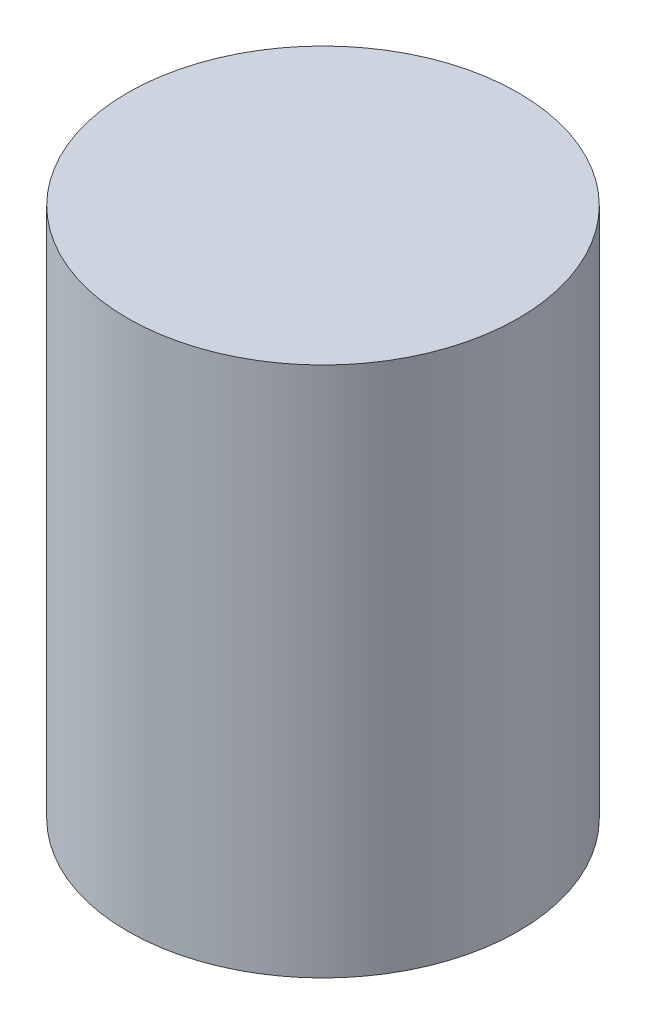
ISO-10303-21;
HEADER;
FILE_DESCRIPTION(('STEP AP214'),'2;1');
FILE_NAME('part.step','',(''),(''),'','','');
FILE_SCHEMA(('AUTOMOTIVE_DESIGN { 1 0 10303 214 1 1 1 1 }'));
ENDSEC;
DATA;
#1=APPLICATION_CONTEXT('core data for automotive mechanical design processes');
#2=APPLICATION_PROTOCOL_DEFINITION('international standard','automotive_design',2000,#1);
#3=PRODUCT_CONTEXT('',#1,'mechanical');
#4=PRODUCT('Part','Part','',(#3));
#5=PRODUCT_RELATED_PRODUCT_CATEGORY('part','',(#4));
#6=PRODUCT_DEFINITION_FORMATION('','',#4);
#7=PRODUCT_DEFINITION_CONTEXT('part definition',#1,'design');
#8=PRODUCT_DEFINITION('design','',#6,#7);
#9=PRODUCT_DEFINITION_SHAPE('','',#8);
#10=(LENGTH_UNIT() NAMED_UNIT(*) SI_UNIT(.MILLI.,.METRE.));
#11=(NAMED_UNIT(*) PLANE_ANGLE_UNIT() SI_UNIT($,.RADIAN.));
#12=(NAMED_UNIT(*) SI_UNIT($,.STERADIAN.) SOLID_ANGLE_UNIT());
#13=UNCERTAINTY_MEASURE_WITH_UNIT(LENGTH_MEASURE(1.E-05),#10,'distance_accuracy_value','');
#14=(GEOMETRIC_REPRESENTATION_CONTEXT(3) GLOBAL_UNCERTAINTY_ASSIGNED_CONTEXT((#13)) GLOBAL_UNIT_ASSIGNED_CONTEXT((#10,
#11,#12)) REPRESENTATION_CONTEXT('',''));
#15=CARTESIAN_POINT('',(0.,0.,0.));
#16=DIRECTION('',(0.,0.,1.));
#17=DIRECTION('',(1.,0.,0.));
#18=AXIS2_PLACEMENT_3D('',#15,#16,#17);
#19=CARTESIAN_POINT('',(0.,200.,0.));
#20=DIRECTION('',(0.,-1.,0.));
#21=DIRECTION('',(0.,0.,-1.));
#22=AXIS2_PLACEMENT_3D('',#19,#20,#21);
#23=CYLINDRICAL_SURFACE('',#22,73.61);
#24=CARTESIAN_POINT('',(0.,200.,0.));
#25=DIRECTION('',(0.,1.,0.));
#26=DIRECTION('',(0.,0.,1.));
#27=AXIS2_PLACEMENT_3D('',#24,#25,#26);
#28=CIRCLE('',#27,73.61);
#29=CARTESIAN_POINT('',(0.,200.,73.61));
#30=VERTEX_POINT('',#29);
#31=EDGE_CURVE('E10',#30,#30,#28,.T.);
#32=ORIENTED_EDGE('',*,*,#31,.F.);
#33=EDGE_LOOP('',(#32));
#34=FACE_BOUND('',#33,.T.);
#35=CARTESIAN_POINT('',(0.,0.,0.));
#36=DIRECTION('',(0.,1.,0.));
#37=DIRECTION('',(0.,0.,1.));
#38=AXIS2_PLACEMENT_3D('',#35,#36,#37);
#39=CIRCLE('',#38,73.61);
#40=CARTESIAN_POINT('',(0.,0.,73.61));
#41=VERTEX_POINT('',#40);
#42=EDGE_CURVE('E36',#41,#41,#39,.T.);
#43=ORIENTED_EDGE('',*,*,#42,.T.);
#44=EDGE_LOOP('',(#43));
#45=FACE_BOUND('',#44,.T.);
#46=ADVANCED_FACE('F33',(#34,#45),#23,.T.);
#47=CARTESIAN_POINT('',(0.,200.,0.));
#48=DIRECTION('',(0.,1.,0.));
#49=DIRECTION('',(0.,0.,1.));
#50=AXIS2_PLACEMENT_3D('',#47,#48,#49);
#51=PLANE('',#50);
#52=ORIENTED_EDGE('',*,*,#31,.T.);
#53=EDGE_LOOP('',(#52));
#54=FACE_BOUND('',#53,.T.);
#55=ADVANCED_FACE('F48',(#54),#51,.T.);
#56=CARTESIAN_POINT('',(0.,0.,0.));
#57=DIRECTION('',(0.,1.,0.));
#58=DIRECTION('',(0.,0.,1.));
#59=AXIS2_PLACEMENT_3D('',#56,#57,#58);
#60=PLANE('',#59);
#61=ORIENTED_EDGE('',*,*,#42,.F.);
#62=EDGE_LOOP('',(#61));
#63=FACE_BOUND('',#62,.T.);
#64=ADVANCED_FACE('F46',(#63),#60,.F.);
#65=CLOSED_SHELL('',(#46,#55,#64));
#66=MANIFOLD_SOLID_BREP('B2',#65);
#67=ADVANCED_BREP_SHAPE_REPRESENTATION('',(#18,#66),#14);
#68=SHAPE_DEFINITION_REPRESENTATION(#9,#67);
ENDSEC;
END-ISO-10303-21;
